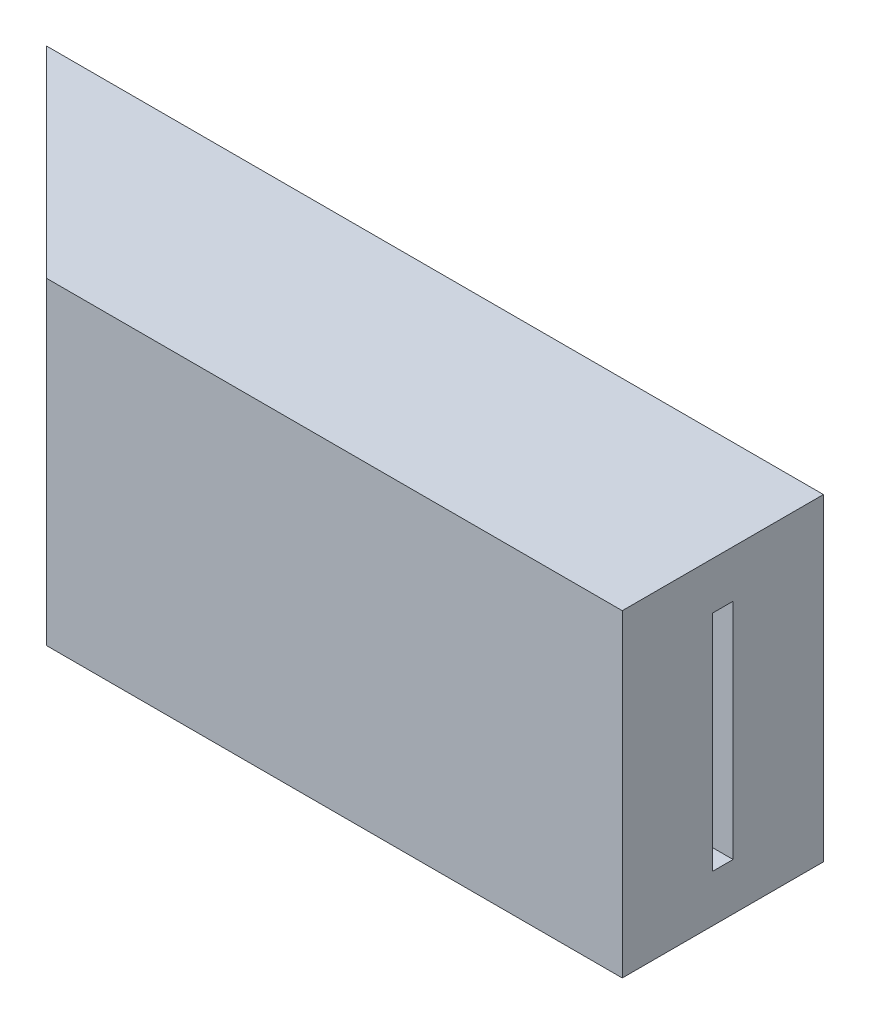
ISO-10303-21;
HEADER;
FILE_DESCRIPTION(('STEP AP214'),'2;1');
FILE_NAME('part.step','',(''),(''),'','','');
FILE_SCHEMA(('AUTOMOTIVE_DESIGN { 1 0 10303 214 1 1 1 1 }'));
ENDSEC;
DATA;
#1=APPLICATION_CONTEXT('core data for automotive mechanical design processes');
#2=APPLICATION_PROTOCOL_DEFINITION('international standard','automotive_design',2000,#1);
#3=PRODUCT_CONTEXT('',#1,'mechanical');
#4=PRODUCT('Part','Part','',(#3));
#5=PRODUCT_RELATED_PRODUCT_CATEGORY('part','',(#4));
#6=PRODUCT_DEFINITION_FORMATION('','',#4);
#7=PRODUCT_DEFINITION_CONTEXT('part definition',#1,'design');
#8=PRODUCT_DEFINITION('design','',#6,#7);
#9=PRODUCT_DEFINITION_SHAPE('','',#8);
#10=(LENGTH_UNIT() NAMED_UNIT(*) SI_UNIT(.MILLI.,.METRE.));
#11=(NAMED_UNIT(*) PLANE_ANGLE_UNIT() SI_UNIT($,.RADIAN.));
#12=(NAMED_UNIT(*) SI_UNIT($,.STERADIAN.) SOLID_ANGLE_UNIT());
#13=UNCERTAINTY_MEASURE_WITH_UNIT(LENGTH_MEASURE(1.E-05),#10,'distance_accuracy_value','');
#14=(GEOMETRIC_REPRESENTATION_CONTEXT(3) GLOBAL_UNCERTAINTY_ASSIGNED_CONTEXT((#13)) GLOBAL_UNIT_ASSIGNED_CONTEXT((#10,
#11,#12)) REPRESENTATION_CONTEXT('',''));
#15=CARTESIAN_POINT('',(0.,0.,0.));
#16=DIRECTION('',(0.,0.,1.));
#17=DIRECTION('',(1.,0.,0.));
#18=AXIS2_PLACEMENT_3D('',#15,#16,#17);
#19=CARTESIAN_POINT('',(24.9936,0.635000000000004,10.5029));
#20=DIRECTION('',(0.,0.,1.));
#21=DIRECTION('',(1.,0.,0.));
#22=AXIS2_PLACEMENT_3D('',#19,#20,#21);
#23=PLANE('',#22);
#24=DIRECTION('',(0.,1.,0.));
#25=VECTOR('',#24,1.);
#26=CARTESIAN_POINT('',(68.58,-0.915741561481477,10.5029));
#27=LINE('',#26,#25);
#28=CARTESIAN_POINT('',(68.58,-15.2273,10.5029));
#29=VERTEX_POINT('',#28);
#30=CARTESIAN_POINT('',(68.58,15.2273000000002,10.5029));
#31=VERTEX_POINT('',#30);
#32=EDGE_CURVE('E254',#29,#31,#27,.T.);
#33=ORIENTED_EDGE('',*,*,#32,.T.);
#34=DIRECTION('',(1.,0.,0.));
#35=VECTOR('',#34,1.);
#36=CARTESIAN_POINT('',(24.9936,15.2273000000002,10.5029));
#37=LINE('',#36,#35);
#38=CARTESIAN_POINT('',(93.98,15.2273000000002,10.5029));
#39=VERTEX_POINT('',#38);
#40=EDGE_CURVE('E404',#31,#39,#37,.T.);
#41=ORIENTED_EDGE('',*,*,#40,.T.);
#42=DIRECTION('',(0.,1.,0.));
#43=VECTOR('',#42,1.);
#44=CARTESIAN_POINT('',(93.98,1.46998694566491,10.5029));
#45=LINE('',#44,#43);
#46=CARTESIAN_POINT('',(93.98,-15.2273,10.5029));
#47=VERTEX_POINT('',#46);
#48=EDGE_CURVE('E340',#47,#39,#45,.T.);
#49=ORIENTED_EDGE('',*,*,#48,.F.);
#50=DIRECTION('',(-1.,0.,0.));
#51=VECTOR('',#50,1.);
#52=CARTESIAN_POINT('',(24.9936,-15.2273,10.5029));
#53=LINE('',#52,#51);
#54=EDGE_CURVE('E401',#47,#29,#53,.T.);
#55=ORIENTED_EDGE('',*,*,#54,.T.);
#56=EDGE_LOOP('',(#33,#41,#49,#55));
#57=FACE_BOUND('',#56,.T.);
#58=ADVANCED_FACE('F32',(#57),#23,.F.);
#59=DIRECTION('',(0.,-1.,0.));
#60=VECTOR('',#59,1.);
#61=CARTESIAN_POINT('',(22.9997,0.635000000000004,10.5029));
#62=LINE('',#61,#60);
#63=CARTESIAN_POINT('',(22.9997,15.2273000000001,10.5029));
#64=VERTEX_POINT('',#63);
#65=CARTESIAN_POINT('',(22.9997,-15.2273,10.5029));
#66=VERTEX_POINT('',#65);
#67=EDGE_CURVE('E345',#64,#66,#62,.T.);
#68=ORIENTED_EDGE('',*,*,#67,.F.);
#69=DIRECTION('',(1.,0.,0.));
#70=VECTOR('',#69,1.);
#71=CARTESIAN_POINT('',(24.9936,15.2273000000001,10.5029));
#72=LINE('',#71,#70);
#73=CARTESIAN_POINT('',(65.405,15.2273000000001,10.5029));
#74=VERTEX_POINT('',#73);
#75=EDGE_CURVE('E375',#64,#74,#72,.T.);
#76=ORIENTED_EDGE('',*,*,#75,.T.);
#77=DIRECTION('',(0.,1.,0.));
#78=VECTOR('',#77,1.);
#79=CARTESIAN_POINT('',(65.405,-0.915741561481477,10.5029));
#80=LINE('',#79,#78);
#81=CARTESIAN_POINT('',(65.405,-15.2273,10.5029));
#82=VERTEX_POINT('',#81);
#83=EDGE_CURVE('E249',#82,#74,#80,.T.);
#84=ORIENTED_EDGE('',*,*,#83,.F.);
#85=DIRECTION('',(-1.,0.,0.));
#86=VECTOR('',#85,1.);
#87=CARTESIAN_POINT('',(24.9936,-15.2273,10.5029));
#88=LINE('',#87,#86);
#89=EDGE_CURVE('E372',#82,#66,#88,.T.);
#90=ORIENTED_EDGE('',*,*,#89,.T.);
#91=EDGE_LOOP('',(#68,#76,#84,#90));
#92=FACE_BOUND('',#91,.T.);
#93=ADVANCED_FACE('F480',(#92),#23,.F.);
#94=CARTESIAN_POINT('',(0.,-17.7673,0.));
#95=DIRECTION('',(0.,1.,0.));
#96=DIRECTION('',(0.,0.,1.));
#97=AXIS2_PLACEMENT_3D('',#94,#95,#96);
#98=PLANE('',#97);
#99=DIRECTION('',(0.,0.,1.));
#100=VECTOR('',#99,1.);
#101=CARTESIAN_POINT('',(65.405,-17.7673,-4.13815200883612));
#102=LINE('',#101,#100);
#103=CARTESIAN_POINT('',(65.405,-17.7673,-7.96290000000008));
#104=VERTEX_POINT('',#103);
#105=CARTESIAN_POINT('',(65.405,-17.7673,-4.13815200883612));
#106=VERTEX_POINT('',#105);
#107=EDGE_CURVE('E262',#104,#106,#102,.T.);
#108=ORIENTED_EDGE('',*,*,#107,.F.);
#109=DIRECTION('',(-1.,0.,0.));
#110=VECTOR('',#109,1.);
#111=CARTESIAN_POINT('',(0.,-17.7673,-7.96290000000001));
#112=LINE('',#111,#110);
#113=CARTESIAN_POINT('',(4.53389999999997,-17.7673,-7.96290000000001));
#114=VERTEX_POINT('',#113);
#115=EDGE_CURVE('E395',#104,#114,#112,.T.);
#116=ORIENTED_EDGE('',*,*,#115,.T.);
#117=DIRECTION('',(-0.707106781186548,0.,-0.707106781186547));
#118=VECTOR('',#117,1.);
#119=CARTESIAN_POINT('',(0.,-17.7673,-12.4968));
#120=LINE('',#119,#118);
#121=CARTESIAN_POINT('',(20.4597,-17.7673,7.96290000000003));
#122=VERTEX_POINT('',#121);
#123=EDGE_CURVE('E274',#122,#114,#120,.T.);
#124=ORIENTED_EDGE('',*,*,#123,.F.);
#125=DIRECTION('',(1.,0.,0.));
#126=VECTOR('',#125,1.);
#127=CARTESIAN_POINT('',(0.,-17.7673,7.96290000000007));
#128=LINE('',#127,#126);
#129=CARTESIAN_POINT('',(65.405,-17.7673,7.9628999999999));
#130=VERTEX_POINT('',#129);
#131=EDGE_CURVE('E393',#122,#130,#128,.T.);
#132=ORIENTED_EDGE('',*,*,#131,.T.);
#133=DIRECTION('',(0.,0.,1.));
#134=VECTOR('',#133,1.);
#135=CARTESIAN_POINT('',(65.405,-17.7673,10.5029));
#136=LINE('',#135,#134);
#137=CARTESIAN_POINT('',(65.405,-17.7673,4.98694847020935));
#138=VERTEX_POINT('',#137);
#139=EDGE_CURVE('E461',#138,#130,#136,.T.);
#140=ORIENTED_EDGE('',*,*,#139,.F.);
#141=DIRECTION('',(-0.991645861104668,0.,0.12899025604278));
#142=VECTOR('',#141,1.);
#143=CARTESIAN_POINT('',(65.405,-17.7673,4.98694847020935));
#144=LINE('',#143,#142);
#145=CARTESIAN_POINT('',(68.58,-17.7673,4.57395419574164));
#146=VERTEX_POINT('',#145);
#147=EDGE_CURVE('E240',#146,#138,#144,.T.);
#148=ORIENTED_EDGE('',*,*,#147,.F.);
#149=DIRECTION('',(0.,0.,-1.));
#150=VECTOR('',#149,1.);
#151=CARTESIAN_POINT('',(68.58,-17.7673,4.57395419574164));
#152=LINE('',#151,#150);
#153=CARTESIAN_POINT('',(68.58,-17.7673,7.96289999999989));
#154=VERTEX_POINT('',#153);
#155=EDGE_CURVE('E466',#154,#146,#152,.T.);
#156=ORIENTED_EDGE('',*,*,#155,.F.);
#157=DIRECTION('',(1.,0.,0.));
#158=VECTOR('',#157,1.);
#159=CARTESIAN_POINT('',(0.,-17.7673,7.96290000000007));
#160=LINE('',#159,#158);
#161=CARTESIAN_POINT('',(93.98,-17.7673,7.96289999999983));
#162=VERTEX_POINT('',#161);
#163=EDGE_CURVE('E391',#154,#162,#160,.T.);
#164=ORIENTED_EDGE('',*,*,#163,.T.);
#165=DIRECTION('',(0.,0.,-1.));
#166=VECTOR('',#165,1.);
#167=CARTESIAN_POINT('',(93.98,-17.7673,-12.4968));
#168=LINE('',#167,#166);
#169=CARTESIAN_POINT('',(93.98,-17.7673,-7.96290000000009));
#170=VERTEX_POINT('',#169);
#171=EDGE_CURVE('E320',#162,#170,#168,.T.);
#172=ORIENTED_EDGE('',*,*,#171,.T.);
#173=DIRECTION('',(-1.,0.,0.));
#174=VECTOR('',#173,1.);
#175=CARTESIAN_POINT('',(0.,-17.7673,-7.96289999999999));
#176=LINE('',#175,#174);
#177=CARTESIAN_POINT('',(68.58,-17.7673,-7.96290000000007));
#178=VERTEX_POINT('',#177);
#179=EDGE_CURVE('E389',#170,#178,#176,.T.);
#180=ORIENTED_EDGE('',*,*,#179,.T.);
#181=DIRECTION('',(0.,0.,-1.));
#182=VECTOR('',#181,1.);
#183=CARTESIAN_POINT('',(68.58,-17.7673,-10.5029));
#184=LINE('',#183,#182);
#185=CARTESIAN_POINT('',(68.58,-17.7673,-3.81946845229878));
#186=VERTEX_POINT('',#185);
#187=EDGE_CURVE('E260',#186,#178,#184,.T.);
#188=ORIENTED_EDGE('',*,*,#187,.F.);
#189=DIRECTION('',(0.99500039868029,0.,0.0998709498606333));
#190=VECTOR('',#189,1.);
#191=CARTESIAN_POINT('',(68.58,-17.7673,-3.81946845229878));
#192=LINE('',#191,#190);
#193=EDGE_CURVE('E241',#106,#186,#192,.T.);
#194=ORIENTED_EDGE('',*,*,#193,.F.);
#195=EDGE_LOOP('',(#108,#116,#124,#132,#140,#148,#156,#164,#172,#180,#188,#194));
#196=FACE_BOUND('',#195,.T.);
#197=ADVANCED_FACE('F450',(#196),#98,.T.);
#198=CARTESIAN_POINT('',(0.,17.7673,0.));
#199=DIRECTION('',(0.,-1.,0.));
#200=DIRECTION('',(0.,0.,-1.));
#201=AXIS2_PLACEMENT_3D('',#198,#199,#200);
#202=PLANE('',#201);
#203=DIRECTION('',(0.,0.,-1.));
#204=VECTOR('',#203,1.);
#205=CARTESIAN_POINT('',(65.405,17.7673,4.98694847020935));
#206=LINE('',#205,#204);
#207=CARTESIAN_POINT('',(65.405,17.7673,7.96289999999994));
#208=VERTEX_POINT('',#207);
#209=CARTESIAN_POINT('',(65.405,17.7673,4.98694847020935));
#210=VERTEX_POINT('',#209);
#211=EDGE_CURVE('E217',#208,#210,#206,.T.);
#212=ORIENTED_EDGE('',*,*,#211,.F.);
#213=DIRECTION('',(-1.,0.,0.));
#214=VECTOR('',#213,1.);
#215=CARTESIAN_POINT('',(0.,17.7673,7.96290000000011));
#216=LINE('',#215,#214);
#217=CARTESIAN_POINT('',(20.4597000000001,17.7673,7.96290000000006));
#218=VERTEX_POINT('',#217);
#219=EDGE_CURVE('E370',#208,#218,#216,.T.);
#220=ORIENTED_EDGE('',*,*,#219,.T.);
#221=DIRECTION('',(-0.707106781186548,0.,-0.707106781186547));
#222=VECTOR('',#221,1.);
#223=CARTESIAN_POINT('',(22.9997,17.7673,10.5029));
#224=LINE('',#223,#222);
#225=CARTESIAN_POINT('',(4.5339,17.7673,-7.96289999999997));
#226=VERTEX_POINT('',#225);
#227=EDGE_CURVE('E334',#218,#226,#224,.T.);
#228=ORIENTED_EDGE('',*,*,#227,.T.);
#229=DIRECTION('',(1.,0.,0.));
#230=VECTOR('',#229,1.);
#231=CARTESIAN_POINT('',(0.,17.7673,-7.96289999999997));
#232=LINE('',#231,#230);
#233=CARTESIAN_POINT('',(65.405,17.7673,-7.96290000000004));
#234=VERTEX_POINT('',#233);
#235=EDGE_CURVE('E367',#226,#234,#232,.T.);
#236=ORIENTED_EDGE('',*,*,#235,.T.);
#237=DIRECTION('',(0.,0.,-1.));
#238=VECTOR('',#237,1.);
#239=CARTESIAN_POINT('',(65.405,17.7673,-10.5029));
#240=LINE('',#239,#238);
#241=CARTESIAN_POINT('',(65.405,17.7673,-4.13815200883612));
#242=VERTEX_POINT('',#241);
#243=EDGE_CURVE('E439',#242,#234,#240,.T.);
#244=ORIENTED_EDGE('',*,*,#243,.F.);
#245=DIRECTION('',(-0.995000398680289,0.,-0.0998709498606345));
#246=VECTOR('',#245,1.);
#247=CARTESIAN_POINT('',(65.405,17.7673,-4.13815200883612));
#248=LINE('',#247,#246);
#249=CARTESIAN_POINT('',(68.58,17.7673,-3.81946845229877));
#250=VERTEX_POINT('',#249);
#251=EDGE_CURVE('E458',#250,#242,#248,.T.);
#252=ORIENTED_EDGE('',*,*,#251,.F.);
#253=DIRECTION('',(0.,0.,1.));
#254=VECTOR('',#253,1.);
#255=CARTESIAN_POINT('',(68.58,17.7673,-3.81946845229877));
#256=LINE('',#255,#254);
#257=CARTESIAN_POINT('',(68.58,17.7673,-7.96289999999998));
#258=VERTEX_POINT('',#257);
#259=EDGE_CURVE('E231',#258,#250,#256,.T.);
#260=ORIENTED_EDGE('',*,*,#259,.F.);
#261=DIRECTION('',(1.,0.,0.));
#262=VECTOR('',#261,1.);
#263=CARTESIAN_POINT('',(0.,17.7673,-7.96289999999991));
#264=LINE('',#263,#262);
#265=CARTESIAN_POINT('',(93.98,17.7673,-7.96290000000001));
#266=VERTEX_POINT('',#265);
#267=EDGE_CURVE('E361',#258,#266,#264,.T.);
#268=ORIENTED_EDGE('',*,*,#267,.T.);
#269=DIRECTION('',(0.,0.,1.));
#270=VECTOR('',#269,1.);
#271=CARTESIAN_POINT('',(93.98,17.7673,-10.5029));
#272=LINE('',#271,#270);
#273=CARTESIAN_POINT('',(93.98,17.7673,7.96289999999997));
#274=VERTEX_POINT('',#273);
#275=EDGE_CURVE('E329',#266,#274,#272,.T.);
#276=ORIENTED_EDGE('',*,*,#275,.T.);
#277=DIRECTION('',(-1.,0.,0.));
#278=VECTOR('',#277,1.);
#279=CARTESIAN_POINT('',(0.,17.7673,7.96290000000021));
#280=LINE('',#279,#278);
#281=CARTESIAN_POINT('',(68.58,17.7673,7.96290000000003));
#282=VERTEX_POINT('',#281);
#283=EDGE_CURVE('E365',#274,#282,#280,.T.);
#284=ORIENTED_EDGE('',*,*,#283,.T.);
#285=DIRECTION('',(0.,0.,1.));
#286=VECTOR('',#285,1.);
#287=CARTESIAN_POINT('',(68.58,17.7673,10.5029));
#288=LINE('',#287,#286);
#289=CARTESIAN_POINT('',(68.58,17.7673,4.57395419574164));
#290=VERTEX_POINT('',#289);
#291=EDGE_CURVE('E247',#290,#282,#288,.T.);
#292=ORIENTED_EDGE('',*,*,#291,.F.);
#293=DIRECTION('',(0.991645861104668,0.,-0.128990256042781));
#294=VECTOR('',#293,1.);
#295=CARTESIAN_POINT('',(68.58,17.7673,4.57395419574164));
#296=LINE('',#295,#294);
#297=EDGE_CURVE('E230',#210,#290,#296,.T.);
#298=ORIENTED_EDGE('',*,*,#297,.F.);
#299=EDGE_LOOP('',(#212,#220,#228,#236,#244,#252,#260,#268,#276,#284,#292,#298));
#300=FACE_BOUND('',#299,.T.);
#301=ADVANCED_FACE('F244',(#300),#202,.T.);
#302=CARTESIAN_POINT('',(1.99389999999999,0.635000000000004,-10.5029));
#303=DIRECTION('',(0.,0.,-1.));
#304=DIRECTION('',(-1.,0.,0.));
#305=AXIS2_PLACEMENT_3D('',#302,#303,#304);
#306=PLANE('',#305);
#307=DIRECTION('',(0.,-1.,0.));
#308=VECTOR('',#307,1.);
#309=CARTESIAN_POINT('',(1.99389999999999,0.635000000000004,-10.5029));
#310=LINE('',#309,#308);
#311=CARTESIAN_POINT('',(1.99389999999999,15.2273,-10.5029));
#312=VERTEX_POINT('',#311);
#313=CARTESIAN_POINT('',(1.99389999999999,-15.2273,-10.5029));
#314=VERTEX_POINT('',#313);
#315=EDGE_CURVE('E346',#312,#314,#310,.T.);
#316=ORIENTED_EDGE('',*,*,#315,.T.);
#317=DIRECTION('',(1.,0.,0.));
#318=VECTOR('',#317,1.);
#319=CARTESIAN_POINT('',(1.99389999999999,-15.2273,-10.5029));
#320=LINE('',#319,#318);
#321=CARTESIAN_POINT('',(65.405,-15.2273,-10.5029));
#322=VERTEX_POINT('',#321);
#323=EDGE_CURVE('E382',#314,#322,#320,.T.);
#324=ORIENTED_EDGE('',*,*,#323,.T.);
#325=DIRECTION('',(0.,-1.,0.));
#326=VECTOR('',#325,1.);
#327=CARTESIAN_POINT('',(65.405,-0.634999999999993,-10.5029));
#328=LINE('',#327,#326);
#329=CARTESIAN_POINT('',(65.405,15.2273,-10.5029));
#330=VERTEX_POINT('',#329);
#331=EDGE_CURVE('E267',#330,#322,#328,.T.);
#332=ORIENTED_EDGE('',*,*,#331,.F.);
#333=DIRECTION('',(-1.,0.,0.));
#334=VECTOR('',#333,1.);
#335=CARTESIAN_POINT('',(1.99389999999999,15.2273,-10.5029));
#336=LINE('',#335,#334);
#337=EDGE_CURVE('E380',#330,#312,#336,.T.);
#338=ORIENTED_EDGE('',*,*,#337,.T.);
#339=EDGE_LOOP('',(#316,#324,#332,#338));
#340=FACE_BOUND('',#339,.T.);
#341=ADVANCED_FACE('F441',(#340),#306,.F.);
#342=DIRECTION('',(0.,-1.,0.));
#343=VECTOR('',#342,1.);
#344=CARTESIAN_POINT('',(93.98,-17.7673,-10.5029));
#345=LINE('',#344,#343);
#346=CARTESIAN_POINT('',(93.98,15.2273,-10.5029));
#347=VERTEX_POINT('',#346);
#348=CARTESIAN_POINT('',(93.98,-15.2273,-10.5029));
#349=VERTEX_POINT('',#348);
#350=EDGE_CURVE('E337',#347,#349,#345,.T.);
#351=ORIENTED_EDGE('',*,*,#350,.F.);
#352=DIRECTION('',(-1.,0.,0.));
#353=VECTOR('',#352,1.);
#354=CARTESIAN_POINT('',(1.99389999999999,15.2273,-10.5029));
#355=LINE('',#354,#353);
#356=CARTESIAN_POINT('',(68.58,15.2273,-10.5029));
#357=VERTEX_POINT('',#356);
#358=EDGE_CURVE('E54',#347,#357,#355,.T.);
#359=ORIENTED_EDGE('',*,*,#358,.T.);
#360=DIRECTION('',(0.,-1.,0.));
#361=VECTOR('',#360,1.);
#362=CARTESIAN_POINT('',(68.58,-0.634999999999993,-10.5029));
#363=LINE('',#362,#361);
#364=CARTESIAN_POINT('',(68.58,-15.2273,-10.5029));
#365=VERTEX_POINT('',#364);
#366=EDGE_CURVE('E270',#357,#365,#363,.T.);
#367=ORIENTED_EDGE('',*,*,#366,.T.);
#368=DIRECTION('',(1.,0.,0.));
#369=VECTOR('',#368,1.);
#370=CARTESIAN_POINT('',(1.99389999999999,-15.2273,-10.5029));
#371=LINE('',#370,#369);
#372=EDGE_CURVE('E414',#365,#349,#371,.T.);
#373=ORIENTED_EDGE('',*,*,#372,.T.);
#374=EDGE_LOOP('',(#351,#359,#367,#373));
#375=FACE_BOUND('',#374,.T.);
#376=ADVANCED_FACE('F505',(#375),#306,.F.);
#377=CARTESIAN_POINT('',(24.9936,-17.7673,-12.4968));
#378=DIRECTION('',(0.,0.,-1.));
#379=DIRECTION('',(-1.,0.,0.));
#380=AXIS2_PLACEMENT_3D('',#377,#378,#379);
#381=PLANE('',#380);
#382=DIRECTION('',(-1.,0.,0.));
#383=VECTOR('',#382,1.);
#384=CARTESIAN_POINT('',(24.9936,19.7612,-12.4968));
#385=LINE('',#384,#383);
#386=CARTESIAN_POINT('',(96.52,19.7612,-12.4968));
#387=VERTEX_POINT('',#386);
#388=CARTESIAN_POINT('',(0.,19.7612,-12.4968));
#389=VERTEX_POINT('',#388);
#390=EDGE_CURVE('E349',#387,#389,#385,.T.);
#391=ORIENTED_EDGE('',*,*,#390,.F.);
#392=DIRECTION('',(0.,1.,0.));
#393=VECTOR('',#392,1.);
#394=CARTESIAN_POINT('',(96.52,19.7612,-12.4968));
#395=LINE('',#394,#393);
#396=CARTESIAN_POINT('',(96.52,-19.7612,-12.4968));
#397=VERTEX_POINT('',#396);
#398=EDGE_CURVE('E321',#397,#387,#395,.T.);
#399=ORIENTED_EDGE('',*,*,#398,.F.);
#400=DIRECTION('',(1.,0.,0.));
#401=VECTOR('',#400,1.);
#402=CARTESIAN_POINT('',(96.52,-19.7612,-12.4968));
#403=LINE('',#402,#401);
#404=CARTESIAN_POINT('',(0.,-19.7612,-12.4968));
#405=VERTEX_POINT('',#404);
#406=EDGE_CURVE('E278',#405,#397,#403,.T.);
#407=ORIENTED_EDGE('',*,*,#406,.F.);
#408=DIRECTION('',(0.,1.,0.));
#409=VECTOR('',#408,1.);
#410=CARTESIAN_POINT('',(0.,-17.7673,-12.4968));
#411=LINE('',#410,#409);
#412=EDGE_CURVE('E357',#405,#389,#411,.T.);
#413=ORIENTED_EDGE('',*,*,#412,.T.);
#414=EDGE_LOOP('',(#391,#399,#407,#413));
#415=FACE_BOUND('',#414,.T.);
#416=ADVANCED_FACE('F511',(#415),#381,.T.);
#417=CARTESIAN_POINT('',(0.,-17.7673,-12.4968));
#418=DIRECTION('',(-0.707106781186547,0.,0.707106781186548));
#419=DIRECTION('',(0.707106781186548,0.,0.707106781186547));
#420=AXIS2_PLACEMENT_3D('',#417,#418,#419);
#421=PLANE('',#420);
#422=ORIENTED_EDGE('',*,*,#67,.T.);
#423=DIRECTION('',(-0.577350269189624,-0.577350269189629,-0.577350269189624));
#424=VECTOR('',#423,1.);
#425=CARTESIAN_POINT('',(23.6643333333333,-14.5626666666667,11.1675333333333));
#426=LINE('',#425,#424);
#427=EDGE_CURVE('E11',#66,#122,#426,.T.);
#428=ORIENTED_EDGE('',*,*,#427,.T.);
#429=ORIENTED_EDGE('',*,*,#123,.T.);
#430=DIRECTION('',(-0.577350269189625,0.577350269189628,-0.577350269189624));
#431=VECTOR('',#430,1.);
#432=CARTESIAN_POINT('',(1.99389999999999,-15.2273,-10.5029));
#433=LINE('',#432,#431);
#434=EDGE_CURVE('E423',#114,#314,#433,.T.);
#435=ORIENTED_EDGE('',*,*,#434,.T.);
#436=ORIENTED_EDGE('',*,*,#315,.F.);
#437=DIRECTION('',(0.577350269189627,0.577350269189624,0.577350269189627));
#438=VECTOR('',#437,1.);
#439=CARTESIAN_POINT('',(3.0226,16.256,-9.47419999999998));
#440=LINE('',#439,#438);
#441=EDGE_CURVE('E40',#312,#226,#440,.T.);
#442=ORIENTED_EDGE('',*,*,#441,.T.);
#443=ORIENTED_EDGE('',*,*,#227,.F.);
#444=DIRECTION('',(0.577350269189626,-0.577350269189625,0.577350269189626));
#445=VECTOR('',#444,1.);
#446=CARTESIAN_POINT('',(13.6398,24.5872,1.14300000000006));
#447=LINE('',#446,#445);
#448=EDGE_CURVE('E421',#218,#64,#447,.T.);
#449=ORIENTED_EDGE('',*,*,#448,.T.);
#450=EDGE_LOOP('',(#422,#428,#429,#435,#436,#442,#443,#449));
#451=FACE_BOUND('',#450,.T.);
#452=ORIENTED_EDGE('',*,*,#412,.F.);
#453=DIRECTION('',(-0.707106781186548,0.,-0.707106781186547));
#454=VECTOR('',#453,1.);
#455=CARTESIAN_POINT('',(0.,-19.7612,-12.4968));
#456=LINE('',#455,#454);
#457=CARTESIAN_POINT('',(24.9936,-19.7612,12.4968));
#458=VERTEX_POINT('',#457);
#459=EDGE_CURVE('E275',#458,#405,#456,.T.);
#460=ORIENTED_EDGE('',*,*,#459,.F.);
#461=DIRECTION('',(0.,1.,0.));
#462=VECTOR('',#461,1.);
#463=CARTESIAN_POINT('',(24.9936,-17.7673,12.4968));
#464=LINE('',#463,#462);
#465=CARTESIAN_POINT('',(24.9936,19.7612,12.4968));
#466=VERTEX_POINT('',#465);
#467=EDGE_CURVE('E358',#458,#466,#464,.T.);
#468=ORIENTED_EDGE('',*,*,#467,.T.);
#469=DIRECTION('',(0.707106781186547,0.,0.707106781186547));
#470=VECTOR('',#469,1.);
#471=CARTESIAN_POINT('',(0.,19.7612,-12.4968));
#472=LINE('',#471,#470);
#473=EDGE_CURVE('E354',#389,#466,#472,.T.);
#474=ORIENTED_EDGE('',*,*,#473,.F.);
#475=EDGE_LOOP('',(#452,#460,#468,#474));
#476=FACE_BOUND('',#475,.T.);
#477=ADVANCED_FACE('F428',(#451,#476),#421,.T.);
#478=CARTESIAN_POINT('',(0.,19.7612,0.));
#479=DIRECTION('',(0.,-1.,0.));
#480=DIRECTION('',(0.,0.,-1.));
#481=AXIS2_PLACEMENT_3D('',#478,#479,#480);
#482=PLANE('',#481);
#483=ORIENTED_EDGE('',*,*,#390,.T.);
#484=ORIENTED_EDGE('',*,*,#473,.T.);
#485=DIRECTION('',(-1.,0.,0.));
#486=VECTOR('',#485,1.);
#487=CARTESIAN_POINT('',(40.005,19.7612,12.4968));
#488=LINE('',#487,#486);
#489=CARTESIAN_POINT('',(96.52,19.7612,12.4968));
#490=VERTEX_POINT('',#489);
#491=EDGE_CURVE('E343',#490,#466,#488,.T.);
#492=ORIENTED_EDGE('',*,*,#491,.F.);
#493=DIRECTION('',(0.,0.,1.));
#494=VECTOR('',#493,1.);
#495=CARTESIAN_POINT('',(96.52,19.7612,12.4968));
#496=LINE('',#495,#494);
#497=EDGE_CURVE('E324',#387,#490,#496,.T.);
#498=ORIENTED_EDGE('',*,*,#497,.F.);
#499=EDGE_LOOP('',(#483,#484,#492,#498));
#500=FACE_BOUND('',#499,.T.);
#501=ADVANCED_FACE('F506',(#500),#482,.F.);
#502=CARTESIAN_POINT('',(40.005,-17.7673,12.4968));
#503=DIRECTION('',(0.,0.,-1.));
#504=DIRECTION('',(-1.,0.,0.));
#505=AXIS2_PLACEMENT_3D('',#502,#503,#504);
#506=PLANE('',#505);
#507=ORIENTED_EDGE('',*,*,#467,.F.);
#508=DIRECTION('',(-1.,0.,0.));
#509=VECTOR('',#508,1.);
#510=CARTESIAN_POINT('',(24.9936,-19.7612,12.4968));
#511=LINE('',#510,#509);
#512=CARTESIAN_POINT('',(96.52,-19.7612,12.4968));
#513=VERTEX_POINT('',#512);
#514=EDGE_CURVE('E284',#513,#458,#511,.T.);
#515=ORIENTED_EDGE('',*,*,#514,.F.);
#516=DIRECTION('',(0.,-1.,0.));
#517=VECTOR('',#516,1.);
#518=CARTESIAN_POINT('',(96.52,-17.7673,12.4968));
#519=LINE('',#518,#517);
#520=EDGE_CURVE('E327',#490,#513,#519,.T.);
#521=ORIENTED_EDGE('',*,*,#520,.F.);
#522=ORIENTED_EDGE('',*,*,#491,.T.);
#523=EDGE_LOOP('',(#507,#515,#521,#522));
#524=FACE_BOUND('',#523,.T.);
#525=ADVANCED_FACE('F501',(#524),#506,.F.);
#526=CARTESIAN_POINT('',(96.52,0.,0.));
#527=DIRECTION('',(-1.,0.,0.));
#528=DIRECTION('',(0.,0.,1.));
#529=AXIS2_PLACEMENT_3D('',#526,#527,#528);
#530=PLANE('',#529);
#531=ORIENTED_EDGE('',*,*,#520,.T.);
#532=DIRECTION('',(0.,0.,1.));
#533=VECTOR('',#532,1.);
#534=CARTESIAN_POINT('',(96.52,-19.7612,12.4968));
#535=LINE('',#534,#533);
#536=EDGE_CURVE('E281',#397,#513,#535,.T.);
#537=ORIENTED_EDGE('',*,*,#536,.F.);
#538=ORIENTED_EDGE('',*,*,#398,.T.);
#539=ORIENTED_EDGE('',*,*,#497,.T.);
#540=EDGE_LOOP('',(#531,#537,#538,#539));
#541=FACE_BOUND('',#540,.T.);
#542=DIRECTION('',(0.,-1.,0.));
#543=VECTOR('',#542,1.);
#544=CARTESIAN_POINT('',(96.52,13.8962,1.27));
#545=LINE('',#544,#543);
#546=CARTESIAN_POINT('',(96.52,13.8962,1.27));
#547=VERTEX_POINT('',#546);
#548=CARTESIAN_POINT('',(96.52,-13.8938,1.27));
#549=VERTEX_POINT('',#548);
#550=EDGE_CURVE('E290',#547,#549,#545,.T.);
#551=ORIENTED_EDGE('',*,*,#550,.F.);
#552=DIRECTION('',(0.,0.,1.));
#553=VECTOR('',#552,1.);
#554=CARTESIAN_POINT('',(96.52,13.8962,-1.27));
#555=LINE('',#554,#553);
#556=CARTESIAN_POINT('',(96.52,13.8962,-1.27));
#557=VERTEX_POINT('',#556);
#558=EDGE_CURVE('E298',#557,#547,#555,.T.);
#559=ORIENTED_EDGE('',*,*,#558,.F.);
#560=DIRECTION('',(0.,1.,0.));
#561=VECTOR('',#560,1.);
#562=CARTESIAN_POINT('',(96.52,-13.8938,-1.27));
#563=LINE('',#562,#561);
#564=CARTESIAN_POINT('',(96.52,-13.8938,-1.27));
#565=VERTEX_POINT('',#564);
#566=EDGE_CURVE('E295',#565,#557,#563,.T.);
#567=ORIENTED_EDGE('',*,*,#566,.F.);
#568=DIRECTION('',(0.,0.,-1.));
#569=VECTOR('',#568,1.);
#570=CARTESIAN_POINT('',(96.52,-13.8938,1.27));
#571=LINE('',#570,#569);
#572=EDGE_CURVE('E292',#549,#565,#571,.T.);
#573=ORIENTED_EDGE('',*,*,#572,.F.);
#574=EDGE_LOOP('',(#551,#559,#567,#573));
#575=FACE_BOUND('',#574,.T.);
#576=ADVANCED_FACE('F522',(#541,#575),#530,.F.);
#577=CARTESIAN_POINT('',(93.98,0.,0.));
#578=DIRECTION('',(-1.,0.,0.));
#579=DIRECTION('',(0.,0.,1.));
#580=AXIS2_PLACEMENT_3D('',#577,#578,#579);
#581=PLANE('',#580);
#582=ORIENTED_EDGE('',*,*,#48,.T.);
#583=DIRECTION('',(0.,0.707106781186546,-0.707106781186549));
#584=VECTOR('',#583,1.);
#585=CARTESIAN_POINT('',(93.98,12.8651,12.8651));
#586=LINE('',#585,#584);
#587=EDGE_CURVE('E412',#39,#274,#586,.T.);
#588=ORIENTED_EDGE('',*,*,#587,.T.);
#589=ORIENTED_EDGE('',*,*,#275,.F.);
#590=DIRECTION('',(0.,-0.707106781186546,-0.707106781186549));
#591=VECTOR('',#590,1.);
#592=CARTESIAN_POINT('',(93.98,12.8651000000001,-12.8651));
#593=LINE('',#592,#591);
#594=EDGE_CURVE('E408',#266,#347,#593,.T.);
#595=ORIENTED_EDGE('',*,*,#594,.T.);
#596=ORIENTED_EDGE('',*,*,#350,.T.);
#597=DIRECTION('',(0.,-0.70710678118655,0.707106781186546));
#598=VECTOR('',#597,1.);
#599=CARTESIAN_POINT('',(93.98,-12.8651,-12.8651000000001));
#600=LINE('',#599,#598);
#601=EDGE_CURVE('E406',#349,#170,#600,.T.);
#602=ORIENTED_EDGE('',*,*,#601,.T.);
#603=ORIENTED_EDGE('',*,*,#171,.F.);
#604=DIRECTION('',(0.,0.70710678118655,0.707106781186545));
#605=VECTOR('',#604,1.);
#606=CARTESIAN_POINT('',(93.98,-12.8650999999999,12.8650999999999));
#607=LINE('',#606,#605);
#608=EDGE_CURVE('E410',#162,#47,#607,.T.);
#609=ORIENTED_EDGE('',*,*,#608,.T.);
#610=EDGE_LOOP('',(#582,#588,#589,#595,#596,#602,#603,#609));
#611=FACE_BOUND('',#610,.T.);
#612=DIRECTION('',(0.,0.,1.));
#613=VECTOR('',#612,1.);
#614=CARTESIAN_POINT('',(93.98,13.8962,-1.27));
#615=LINE('',#614,#613);
#616=CARTESIAN_POINT('',(93.98,13.8962,-1.27));
#617=VERTEX_POINT('',#616);
#618=CARTESIAN_POINT('',(93.98,13.8962,1.27));
#619=VERTEX_POINT('',#618);
#620=EDGE_CURVE('E293',#617,#619,#615,.T.);
#621=ORIENTED_EDGE('',*,*,#620,.T.);
#622=DIRECTION('',(0.,-1.,0.));
#623=VECTOR('',#622,1.);
#624=CARTESIAN_POINT('',(93.98,13.8962,1.27));
#625=LINE('',#624,#623);
#626=CARTESIAN_POINT('',(93.98,-13.8938,1.27));
#627=VERTEX_POINT('',#626);
#628=EDGE_CURVE('E287',#619,#627,#625,.T.);
#629=ORIENTED_EDGE('',*,*,#628,.T.);
#630=DIRECTION('',(0.,0.,-1.));
#631=VECTOR('',#630,1.);
#632=CARTESIAN_POINT('',(93.98,-13.8938,1.27));
#633=LINE('',#632,#631);
#634=CARTESIAN_POINT('',(93.98,-13.8938,-1.27));
#635=VERTEX_POINT('',#634);
#636=EDGE_CURVE('E303',#627,#635,#633,.T.);
#637=ORIENTED_EDGE('',*,*,#636,.T.);
#638=DIRECTION('',(0.,1.,0.));
#639=VECTOR('',#638,1.);
#640=CARTESIAN_POINT('',(93.98,-13.8938,-1.27));
#641=LINE('',#640,#639);
#642=EDGE_CURVE('E306',#635,#617,#641,.T.);
#643=ORIENTED_EDGE('',*,*,#642,.T.);
#644=EDGE_LOOP('',(#621,#629,#637,#643));
#645=FACE_BOUND('',#644,.T.);
#646=ADVANCED_FACE('F556',(#611,#645),#581,.T.);
#647=CARTESIAN_POINT('',(96.52,13.8962,1.27));
#648=DIRECTION('',(0.,0.,-1.));
#649=DIRECTION('',(0.,1.,0.));
#650=AXIS2_PLACEMENT_3D('',#647,#648,#649);
#651=PLANE('',#650);
#652=ORIENTED_EDGE('',*,*,#628,.F.);
#653=DIRECTION('',(-1.,0.,0.));
#654=VECTOR('',#653,1.);
#655=CARTESIAN_POINT('',(96.52,13.8962,1.27));
#656=LINE('',#655,#654);
#657=EDGE_CURVE('E300',#547,#619,#656,.T.);
#658=ORIENTED_EDGE('',*,*,#657,.F.);
#659=ORIENTED_EDGE('',*,*,#550,.T.);
#660=DIRECTION('',(-1.,0.,0.));
#661=VECTOR('',#660,1.);
#662=CARTESIAN_POINT('',(96.52,-13.8938,1.27));
#663=LINE('',#662,#661);
#664=EDGE_CURVE('E317',#549,#627,#663,.T.);
#665=ORIENTED_EDGE('',*,*,#664,.T.);
#666=EDGE_LOOP('',(#652,#658,#659,#665));
#667=FACE_BOUND('',#666,.T.);
#668=ADVANCED_FACE('F552',(#667),#651,.T.);
#669=CARTESIAN_POINT('',(96.52,-13.8938,1.27));
#670=DIRECTION('',(0.,1.,0.));
#671=DIRECTION('',(0.,0.,1.));
#672=AXIS2_PLACEMENT_3D('',#669,#670,#671);
#673=PLANE('',#672);
#674=ORIENTED_EDGE('',*,*,#636,.F.);
#675=ORIENTED_EDGE('',*,*,#664,.F.);
#676=ORIENTED_EDGE('',*,*,#572,.T.);
#677=DIRECTION('',(-1.,0.,0.));
#678=VECTOR('',#677,1.);
#679=CARTESIAN_POINT('',(96.52,-13.8938,-1.27));
#680=LINE('',#679,#678);
#681=EDGE_CURVE('E315',#565,#635,#680,.T.);
#682=ORIENTED_EDGE('',*,*,#681,.T.);
#683=EDGE_LOOP('',(#674,#675,#676,#682));
#684=FACE_BOUND('',#683,.T.);
#685=ADVANCED_FACE('F548',(#684),#673,.T.);
#686=CARTESIAN_POINT('',(96.52,-13.8938,-1.27));
#687=DIRECTION('',(0.,0.,1.));
#688=DIRECTION('',(1.,0.,0.));
#689=AXIS2_PLACEMENT_3D('',#686,#687,#688);
#690=PLANE('',#689);
#691=ORIENTED_EDGE('',*,*,#642,.F.);
#692=ORIENTED_EDGE('',*,*,#681,.F.);
#693=ORIENTED_EDGE('',*,*,#566,.T.);
#694=DIRECTION('',(-1.,0.,0.));
#695=VECTOR('',#694,1.);
#696=CARTESIAN_POINT('',(96.52,13.8962,-1.27));
#697=LINE('',#696,#695);
#698=EDGE_CURVE('E313',#557,#617,#697,.T.);
#699=ORIENTED_EDGE('',*,*,#698,.T.);
#700=EDGE_LOOP('',(#691,#692,#693,#699));
#701=FACE_BOUND('',#700,.T.);
#702=ADVANCED_FACE('F539',(#701),#690,.T.);
#703=CARTESIAN_POINT('',(96.52,13.8962,-1.27));
#704=DIRECTION('',(0.,-1.,0.));
#705=DIRECTION('',(0.,0.,-1.));
#706=AXIS2_PLACEMENT_3D('',#703,#704,#705);
#707=PLANE('',#706);
#708=ORIENTED_EDGE('',*,*,#620,.F.);
#709=ORIENTED_EDGE('',*,*,#698,.F.);
#710=ORIENTED_EDGE('',*,*,#558,.T.);
#711=ORIENTED_EDGE('',*,*,#657,.T.);
#712=EDGE_LOOP('',(#708,#709,#710,#711));
#713=FACE_BOUND('',#712,.T.);
#714=ADVANCED_FACE('F531',(#713),#707,.T.);
#715=CARTESIAN_POINT('',(0.,-19.7612,0.));
#716=DIRECTION('',(0.,1.,0.));
#717=DIRECTION('',(0.,0.,1.));
#718=AXIS2_PLACEMENT_3D('',#715,#716,#717);
#719=PLANE('',#718);
#720=ORIENTED_EDGE('',*,*,#459,.T.);
#721=ORIENTED_EDGE('',*,*,#406,.T.);
#722=ORIENTED_EDGE('',*,*,#536,.T.);
#723=ORIENTED_EDGE('',*,*,#514,.T.);
#724=EDGE_LOOP('',(#720,#721,#722,#723));
#725=FACE_BOUND('',#724,.T.);
#726=ADVANCED_FACE('F529',(#725),#719,.F.);
#727=CARTESIAN_POINT('',(68.58,-0.634999999999993,-3.81946845229878));
#728=DIRECTION('',(0.0998709498606333,0.,-0.995000398680289));
#729=DIRECTION('',(-0.995000398680289,0.,-0.0998709498606333));
#730=AXIS2_PLACEMENT_3D('',#727,#728,#729);
#731=PLANE('',#730);
#732=DIRECTION('',(0.,-1.,0.));
#733=VECTOR('',#732,1.);
#734=CARTESIAN_POINT('',(65.405,-0.634999999999993,-4.13815200883612));
#735=LINE('',#734,#733);
#736=EDGE_CURVE('E264',#242,#106,#735,.T.);
#737=ORIENTED_EDGE('',*,*,#736,.T.);
#738=ORIENTED_EDGE('',*,*,#193,.T.);
#739=DIRECTION('',(0.,-1.,0.));
#740=VECTOR('',#739,1.);
#741=CARTESIAN_POINT('',(68.58,-0.634999999999993,-3.81946845229878));
#742=LINE('',#741,#740);
#743=EDGE_CURVE('E272',#250,#186,#742,.T.);
#744=ORIENTED_EDGE('',*,*,#743,.F.);
#745=ORIENTED_EDGE('',*,*,#251,.T.);
#746=EDGE_LOOP('',(#737,#738,#744,#745));
#747=FACE_BOUND('',#746,.T.);
#748=ADVANCED_FACE('F455',(#747),#731,.F.);
#749=CARTESIAN_POINT('',(68.58,-0.634999999999993,-10.5029));
#750=DIRECTION('',(-1.,0.,0.));
#751=DIRECTION('',(0.,0.,1.));
#752=AXIS2_PLACEMENT_3D('',#749,#750,#751);
#753=PLANE('',#752);
#754=ORIENTED_EDGE('',*,*,#366,.F.);
#755=DIRECTION('',(0.,0.707106781186546,0.707106781186549));
#756=VECTOR('',#755,1.);
#757=CARTESIAN_POINT('',(68.58,17.7673,-7.96289999999995));
#758=LINE('',#757,#756);
#759=EDGE_CURVE('E419',#357,#258,#758,.T.);
#760=ORIENTED_EDGE('',*,*,#759,.T.);
#761=ORIENTED_EDGE('',*,*,#259,.T.);
#762=ORIENTED_EDGE('',*,*,#743,.T.);
#763=ORIENTED_EDGE('',*,*,#187,.T.);
#764=DIRECTION('',(0.,0.70710678118655,-0.707106781186546));
#765=VECTOR('',#764,1.);
#766=CARTESIAN_POINT('',(68.58,-15.2273,-10.5029));
#767=LINE('',#766,#765);
#768=EDGE_CURVE('E47',#178,#365,#767,.T.);
#769=ORIENTED_EDGE('',*,*,#768,.T.);
#770=EDGE_LOOP('',(#754,#760,#761,#762,#763,#769));
#771=FACE_BOUND('',#770,.T.);
#772=ADVANCED_FACE('F537',(#771),#753,.F.);
#773=CARTESIAN_POINT('',(65.405,-0.634999999999993,-4.13815200883612));
#774=DIRECTION('',(1.,0.,0.));
#775=DIRECTION('',(0.,0.,-1.));
#776=AXIS2_PLACEMENT_3D('',#773,#774,#775);
#777=PLANE('',#776);
#778=ORIENTED_EDGE('',*,*,#331,.T.);
#779=DIRECTION('',(0.,-0.70710678118655,0.707106781186546));
#780=VECTOR('',#779,1.);
#781=CARTESIAN_POINT('',(65.405,-15.2273,-10.5029));
#782=LINE('',#781,#780);
#783=EDGE_CURVE('E387',#322,#104,#782,.T.);
#784=ORIENTED_EDGE('',*,*,#783,.T.);
#785=ORIENTED_EDGE('',*,*,#107,.T.);
#786=ORIENTED_EDGE('',*,*,#736,.F.);
#787=ORIENTED_EDGE('',*,*,#243,.T.);
#788=DIRECTION('',(0.,-0.707106781186546,-0.707106781186549));
#789=VECTOR('',#788,1.);
#790=CARTESIAN_POINT('',(65.405,17.7673,-7.9629));
#791=LINE('',#790,#789);
#792=EDGE_CURVE('E385',#234,#330,#791,.T.);
#793=ORIENTED_EDGE('',*,*,#792,.T.);
#794=EDGE_LOOP('',(#778,#784,#785,#786,#787,#793));
#795=FACE_BOUND('',#794,.T.);
#796=ADVANCED_FACE('F438',(#795),#777,.F.);
#797=CARTESIAN_POINT('',(65.405,-0.915741561481477,4.98694847020935));
#798=DIRECTION('',(1.,0.,0.));
#799=DIRECTION('',(0.,0.,-1.));
#800=AXIS2_PLACEMENT_3D('',#797,#798,#799);
#801=PLANE('',#800);
#802=ORIENTED_EDGE('',*,*,#83,.T.);
#803=DIRECTION('',(0.,0.707106781186546,-0.707106781186549));
#804=VECTOR('',#803,1.);
#805=CARTESIAN_POINT('',(65.405,17.7672999999999,7.96290000000003));
#806=LINE('',#805,#804);
#807=EDGE_CURVE('E225',#74,#208,#806,.T.);
#808=ORIENTED_EDGE('',*,*,#807,.T.);
#809=ORIENTED_EDGE('',*,*,#211,.T.);
#810=DIRECTION('',(0.,1.,0.));
#811=VECTOR('',#810,1.);
#812=CARTESIAN_POINT('',(65.405,-0.915741561481477,4.98694847020935));
#813=LINE('',#812,#811);
#814=EDGE_CURVE('E222',#138,#210,#813,.T.);
#815=ORIENTED_EDGE('',*,*,#814,.F.);
#816=ORIENTED_EDGE('',*,*,#139,.T.);
#817=DIRECTION('',(0.,0.70710678118655,0.707106781186545));
#818=VECTOR('',#817,1.);
#819=CARTESIAN_POINT('',(65.405,-15.2272999999999,10.5028999999999));
#820=LINE('',#819,#818);
#821=EDGE_CURVE('E377',#130,#82,#820,.T.);
#822=ORIENTED_EDGE('',*,*,#821,.T.);
#823=EDGE_LOOP('',(#802,#808,#809,#815,#816,#822));
#824=FACE_BOUND('',#823,.T.);
#825=ADVANCED_FACE('F220',(#824),#801,.F.);
#826=CARTESIAN_POINT('',(68.58,-0.915741561481477,4.57395419574164));
#827=DIRECTION('',(0.128990256042781,0.,0.991645861104668));
#828=DIRECTION('',(0.991645861104668,0.,-0.128990256042781));
#829=AXIS2_PLACEMENT_3D('',#826,#827,#828);
#830=PLANE('',#829);
#831=ORIENTED_EDGE('',*,*,#814,.T.);
#832=ORIENTED_EDGE('',*,*,#297,.T.);
#833=DIRECTION('',(0.,1.,0.));
#834=VECTOR('',#833,1.);
#835=CARTESIAN_POINT('',(68.58,-0.915741561481477,4.57395419574164));
#836=LINE('',#835,#834);
#837=EDGE_CURVE('E242',#146,#290,#836,.T.);
#838=ORIENTED_EDGE('',*,*,#837,.F.);
#839=ORIENTED_EDGE('',*,*,#147,.T.);
#840=EDGE_LOOP('',(#831,#832,#838,#839));
#841=FACE_BOUND('',#840,.T.);
#842=ADVANCED_FACE('F236',(#841),#830,.F.);
#843=CARTESIAN_POINT('',(68.58,-0.915741561481477,10.5029));
#844=DIRECTION('',(-1.,0.,0.));
#845=DIRECTION('',(0.,0.,1.));
#846=AXIS2_PLACEMENT_3D('',#843,#844,#845);
#847=PLANE('',#846);
#848=ORIENTED_EDGE('',*,*,#291,.T.);
#849=DIRECTION('',(0.,-0.707106781186546,0.707106781186549));
#850=VECTOR('',#849,1.);
#851=CARTESIAN_POINT('',(68.58,17.7672999999999,7.96290000000012));
#852=LINE('',#851,#850);
#853=EDGE_CURVE('E399',#282,#31,#852,.T.);
#854=ORIENTED_EDGE('',*,*,#853,.T.);
#855=ORIENTED_EDGE('',*,*,#32,.F.);
#856=DIRECTION('',(0.,-0.70710678118655,-0.707106781186545));
#857=VECTOR('',#856,1.);
#858=CARTESIAN_POINT('',(68.58,-15.2272999999999,10.5028999999999));
#859=LINE('',#858,#857);
#860=EDGE_CURVE('E397',#29,#154,#859,.T.);
#861=ORIENTED_EDGE('',*,*,#860,.T.);
#862=ORIENTED_EDGE('',*,*,#155,.T.);
#863=ORIENTED_EDGE('',*,*,#837,.T.);
#864=EDGE_LOOP('',(#848,#854,#855,#861,#862,#863));
#865=FACE_BOUND('',#864,.T.);
#866=ADVANCED_FACE('F469',(#865),#847,.F.);
#867=CARTESIAN_POINT('',(0.,17.7673,7.96290000000011));
#868=DIRECTION('',(0.,0.707106781186549,0.707106781186546));
#869=DIRECTION('',(-1.,0.,0.));
#870=AXIS2_PLACEMENT_3D('',#867,#868,#869);
#871=PLANE('',#870);
#872=ORIENTED_EDGE('',*,*,#807,.F.);
#873=ORIENTED_EDGE('',*,*,#75,.F.);
#874=ORIENTED_EDGE('',*,*,#448,.F.);
#875=ORIENTED_EDGE('',*,*,#219,.F.);
#876=EDGE_LOOP('',(#872,#873,#874,#875));
#877=FACE_BOUND('',#876,.T.);
#878=ADVANCED_FACE('F483',(#877),#871,.F.);
#879=CARTESIAN_POINT('',(1.99389999999999,-15.2273,-10.5029));
#880=DIRECTION('',(0.,-0.707106781186545,-0.707106781186549));
#881=DIRECTION('',(1.,0.,0.));
#882=AXIS2_PLACEMENT_3D('',#879,#880,#881);
#883=PLANE('',#882);
#884=ORIENTED_EDGE('',*,*,#434,.F.);
#885=ORIENTED_EDGE('',*,*,#115,.F.);
#886=ORIENTED_EDGE('',*,*,#783,.F.);
#887=ORIENTED_EDGE('',*,*,#323,.F.);
#888=EDGE_LOOP('',(#884,#885,#886,#887));
#889=FACE_BOUND('',#888,.T.);
#890=ADVANCED_FACE('F445',(#889),#883,.F.);
#891=CARTESIAN_POINT('',(0.,17.7673,-7.96289999999997));
#892=DIRECTION('',(0.,0.707106781186549,-0.707106781186546));
#893=DIRECTION('',(1.,0.,0.));
#894=AXIS2_PLACEMENT_3D('',#891,#892,#893);
#895=PLANE('',#894);
#896=ORIENTED_EDGE('',*,*,#441,.F.);
#897=ORIENTED_EDGE('',*,*,#337,.F.);
#898=ORIENTED_EDGE('',*,*,#792,.F.);
#899=ORIENTED_EDGE('',*,*,#235,.F.);
#900=EDGE_LOOP('',(#896,#897,#898,#899));
#901=FACE_BOUND('',#900,.T.);
#902=ADVANCED_FACE('F435',(#901),#895,.F.);
#903=CARTESIAN_POINT('',(0.,17.7673,7.96290000000021));
#904=DIRECTION('',(0.,0.707106781186549,0.707106781186546));
#905=DIRECTION('',(-1.,0.,0.));
#906=AXIS2_PLACEMENT_3D('',#903,#904,#905);
#907=PLANE('',#906);
#908=ORIENTED_EDGE('',*,*,#587,.F.);
#909=ORIENTED_EDGE('',*,*,#40,.F.);
#910=ORIENTED_EDGE('',*,*,#853,.F.);
#911=ORIENTED_EDGE('',*,*,#283,.F.);
#912=EDGE_LOOP('',(#908,#909,#910,#911));
#913=FACE_BOUND('',#912,.T.);
#914=ADVANCED_FACE('F651',(#913),#907,.F.);
#915=CARTESIAN_POINT('',(24.9936,-15.2273,10.5029));
#916=DIRECTION('',(0.,-0.707106781186545,0.70710678118655));
#917=DIRECTION('',(-1.,0.,0.));
#918=AXIS2_PLACEMENT_3D('',#915,#916,#917);
#919=PLANE('',#918);
#920=ORIENTED_EDGE('',*,*,#821,.F.);
#921=ORIENTED_EDGE('',*,*,#131,.F.);
#922=ORIENTED_EDGE('',*,*,#427,.F.);
#923=ORIENTED_EDGE('',*,*,#89,.F.);
#924=EDGE_LOOP('',(#920,#921,#922,#923));
#925=FACE_BOUND('',#924,.T.);
#926=ADVANCED_FACE('F477',(#925),#919,.F.);
#927=CARTESIAN_POINT('',(24.9936,-15.2273,10.5029));
#928=DIRECTION('',(0.,-0.707106781186545,0.70710678118655));
#929=DIRECTION('',(-1.,0.,0.));
#930=AXIS2_PLACEMENT_3D('',#927,#928,#929);
#931=PLANE('',#930);
#932=ORIENTED_EDGE('',*,*,#608,.F.);
#933=ORIENTED_EDGE('',*,*,#163,.F.);
#934=ORIENTED_EDGE('',*,*,#860,.F.);
#935=ORIENTED_EDGE('',*,*,#54,.F.);
#936=EDGE_LOOP('',(#932,#933,#934,#935));
#937=FACE_BOUND('',#936,.T.);
#938=ADVANCED_FACE('F669',(#937),#931,.F.);
#939=CARTESIAN_POINT('',(0.,17.7673,-7.96289999999991));
#940=DIRECTION('',(0.,0.707106781186549,-0.707106781186546));
#941=DIRECTION('',(1.,0.,0.));
#942=AXIS2_PLACEMENT_3D('',#939,#940,#941);
#943=PLANE('',#942);
#944=ORIENTED_EDGE('',*,*,#759,.F.);
#945=ORIENTED_EDGE('',*,*,#358,.F.);
#946=ORIENTED_EDGE('',*,*,#594,.F.);
#947=ORIENTED_EDGE('',*,*,#267,.F.);
#948=EDGE_LOOP('',(#944,#945,#946,#947));
#949=FACE_BOUND('',#948,.T.);
#950=ADVANCED_FACE('F678',(#949),#943,.F.);
#951=CARTESIAN_POINT('',(1.99389999999999,-15.2273,-10.5029));
#952=DIRECTION('',(0.,-0.707106781186546,-0.70710678118655));
#953=DIRECTION('',(1.,0.,0.));
#954=AXIS2_PLACEMENT_3D('',#951,#952,#953);
#955=PLANE('',#954);
#956=ORIENTED_EDGE('',*,*,#768,.F.);
#957=ORIENTED_EDGE('',*,*,#179,.F.);
#958=ORIENTED_EDGE('',*,*,#601,.F.);
#959=ORIENTED_EDGE('',*,*,#372,.F.);
#960=EDGE_LOOP('',(#956,#957,#958,#959));
#961=FACE_BOUND('',#960,.T.);
#962=ADVANCED_FACE('F34',(#961),#955,.F.);
#963=CLOSED_SHELL('',(#58,#93,#197,#301,#341,#376,#416,#477,#501,#525,#576,#646,#668,#685,#702,
#714,#726,#748,#772,#796,#825,#842,#866,#878,#890,#902,#914,#926,#938,#950,#962));
#964=MANIFOLD_SOLID_BREP('B2',#963);
#965=ADVANCED_BREP_SHAPE_REPRESENTATION('',(#18,#964),#14);
#966=SHAPE_DEFINITION_REPRESENTATION(#9,#965);
ENDSEC;
END-ISO-10303-21;
